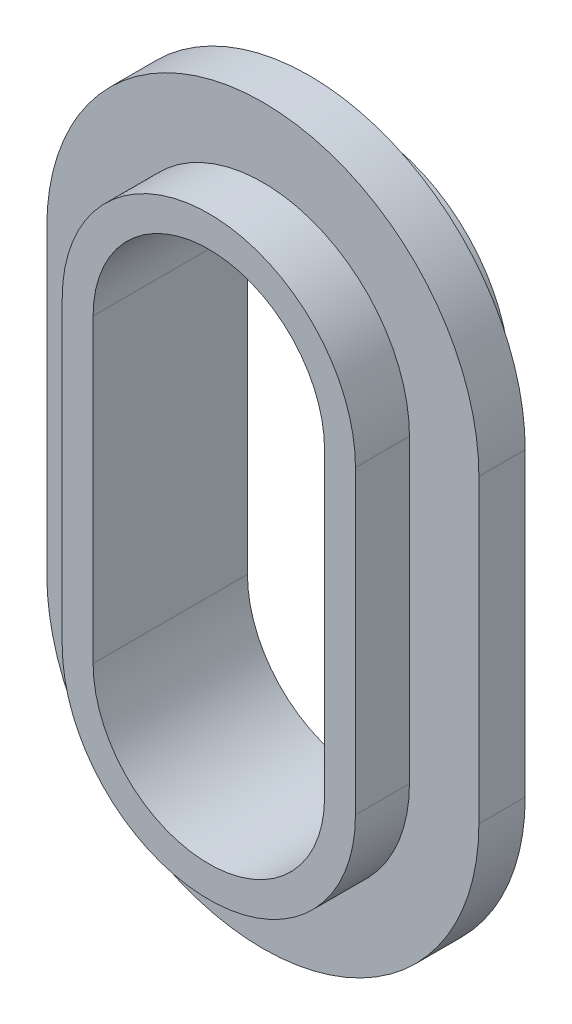
ISO-10303-21;
HEADER;
FILE_DESCRIPTION(('STEP AP214'),'2;1');
FILE_NAME('part.step','',(''),(''),'','','');
FILE_SCHEMA(('AUTOMOTIVE_DESIGN { 1 0 10303 214 1 1 1 1 }'));
ENDSEC;
DATA;
#1=APPLICATION_CONTEXT('core data for automotive mechanical design processes');
#2=APPLICATION_PROTOCOL_DEFINITION('international standard','automotive_design',2000,#1);
#3=PRODUCT_CONTEXT('',#1,'mechanical');
#4=PRODUCT('Part','Part','',(#3));
#5=PRODUCT_RELATED_PRODUCT_CATEGORY('part','',(#4));
#6=PRODUCT_DEFINITION_FORMATION('','',#4);
#7=PRODUCT_DEFINITION_CONTEXT('part definition',#1,'design');
#8=PRODUCT_DEFINITION('design','',#6,#7);
#9=PRODUCT_DEFINITION_SHAPE('','',#8);
#10=(LENGTH_UNIT() NAMED_UNIT(*) SI_UNIT(.MILLI.,.METRE.));
#11=(NAMED_UNIT(*) PLANE_ANGLE_UNIT() SI_UNIT($,.RADIAN.));
#12=(NAMED_UNIT(*) SI_UNIT($,.STERADIAN.) SOLID_ANGLE_UNIT());
#13=UNCERTAINTY_MEASURE_WITH_UNIT(LENGTH_MEASURE(1.E-05),#10,'distance_accuracy_value','');
#14=(GEOMETRIC_REPRESENTATION_CONTEXT(3) GLOBAL_UNCERTAINTY_ASSIGNED_CONTEXT((#13)) GLOBAL_UNIT_ASSIGNED_CONTEXT((#10,
#11,#12)) REPRESENTATION_CONTEXT('',''));
#15=CARTESIAN_POINT('',(0.,0.,0.));
#16=DIRECTION('',(0.,0.,1.));
#17=DIRECTION('',(1.,0.,0.));
#18=AXIS2_PLACEMENT_3D('',#15,#16,#17);
#19=CARTESIAN_POINT('',(0.,-7.8,2.));
#20=DIRECTION('',(0.,0.,1.));
#21=DIRECTION('',(1.,0.,0.));
#22=AXIS2_PLACEMENT_3D('',#19,#20,#21);
#23=PLANE('',#22);
#24=DIRECTION('',(0.,-1.,0.));
#25=VECTOR('',#24,1.);
#26=CARTESIAN_POINT('',(3.8,0.,2.));
#27=LINE('',#26,#25);
#28=CARTESIAN_POINT('',(3.8,0.,2.));
#29=VERTEX_POINT('',#28);
#30=CARTESIAN_POINT('',(3.8,-7.8,2.));
#31=VERTEX_POINT('',#30);
#32=EDGE_CURVE('E155',#29,#31,#27,.T.);
#33=ORIENTED_EDGE('',*,*,#32,.F.);
#34=CARTESIAN_POINT('',(0.,0.,2.));
#35=DIRECTION('',(0.,0.,1.));
#36=DIRECTION('',(1.,0.,0.));
#37=AXIS2_PLACEMENT_3D('',#34,#35,#36);
#38=CIRCLE('',#37,3.8);
#39=CARTESIAN_POINT('',(-3.8,0.,2.));
#40=VERTEX_POINT('',#39);
#41=EDGE_CURVE('E193',#29,#40,#38,.T.);
#42=ORIENTED_EDGE('',*,*,#41,.T.);
#43=DIRECTION('',(0.,-1.,0.));
#44=VECTOR('',#43,1.);
#45=CARTESIAN_POINT('',(-3.8,0.,2.));
#46=LINE('',#45,#44);
#47=CARTESIAN_POINT('',(-3.8,-7.8,2.));
#48=VERTEX_POINT('',#47);
#49=EDGE_CURVE('E190',#40,#48,#46,.T.);
#50=ORIENTED_EDGE('',*,*,#49,.T.);
#51=CARTESIAN_POINT('',(0.,-7.8,2.));
#52=DIRECTION('',(0.,0.,1.));
#53=DIRECTION('',(1.,0.,0.));
#54=AXIS2_PLACEMENT_3D('',#51,#52,#53);
#55=CIRCLE('',#54,3.8);
#56=EDGE_CURVE('E187',#48,#31,#55,.T.);
#57=ORIENTED_EDGE('',*,*,#56,.T.);
#58=EDGE_LOOP('',(#33,#42,#50,#57));
#59=FACE_BOUND('',#58,.T.);
#60=CARTESIAN_POINT('',(0.,0.,2.));
#61=DIRECTION('',(0.,0.,1.));
#62=DIRECTION('',(1.,0.,0.));
#63=AXIS2_PLACEMENT_3D('',#60,#61,#62);
#64=CIRCLE('',#63,3.);
#65=CARTESIAN_POINT('',(3.,0.,2.));
#66=VERTEX_POINT('',#65);
#67=CARTESIAN_POINT('',(-3.,0.,2.));
#68=VERTEX_POINT('',#67);
#69=EDGE_CURVE('E168',#66,#68,#64,.T.);
#70=ORIENTED_EDGE('',*,*,#69,.F.);
#71=DIRECTION('',(0.,-1.,0.));
#72=VECTOR('',#71,1.);
#73=CARTESIAN_POINT('',(3.,0.,2.));
#74=LINE('',#73,#72);
#75=CARTESIAN_POINT('',(3.,-7.8,2.));
#76=VERTEX_POINT('',#75);
#77=EDGE_CURVE('E52',#66,#76,#74,.T.);
#78=ORIENTED_EDGE('',*,*,#77,.T.);
#79=CARTESIAN_POINT('',(0.,-7.8,2.));
#80=DIRECTION('',(0.,0.,1.));
#81=DIRECTION('',(1.,0.,0.));
#82=AXIS2_PLACEMENT_3D('',#79,#80,#81);
#83=CIRCLE('',#82,3.);
#84=CARTESIAN_POINT('',(-3.,-7.8,2.));
#85=VERTEX_POINT('',#84);
#86=EDGE_CURVE('E159',#85,#76,#83,.T.);
#87=ORIENTED_EDGE('',*,*,#86,.F.);
#88=DIRECTION('',(0.,-1.,0.));
#89=VECTOR('',#88,1.);
#90=CARTESIAN_POINT('',(-3.,0.,2.));
#91=LINE('',#90,#89);
#92=EDGE_CURVE('E164',#68,#85,#91,.T.);
#93=ORIENTED_EDGE('',*,*,#92,.F.);
#94=EDGE_LOOP('',(#70,#78,#87,#93));
#95=FACE_BOUND('',#94,.T.);
#96=ADVANCED_FACE('F37',(#59,#95),#23,.T.);
#97=CARTESIAN_POINT('',(0.,-7.8,-2.));
#98=DIRECTION('',(0.,0.,1.));
#99=DIRECTION('',(1.,0.,0.));
#100=AXIS2_PLACEMENT_3D('',#97,#98,#99);
#101=PLANE('',#100);
#102=DIRECTION('',(0.,-1.,0.));
#103=VECTOR('',#102,1.);
#104=CARTESIAN_POINT('',(3.8,0.,-2.));
#105=LINE('',#104,#103);
#106=CARTESIAN_POINT('',(3.8,0.,-2.));
#107=VERTEX_POINT('',#106);
#108=CARTESIAN_POINT('',(3.8,-7.8,-2.));
#109=VERTEX_POINT('',#108);
#110=EDGE_CURVE('E196',#107,#109,#105,.T.);
#111=ORIENTED_EDGE('',*,*,#110,.T.);
#112=CARTESIAN_POINT('',(0.,-7.8,-2.));
#113=DIRECTION('',(0.,0.,1.));
#114=DIRECTION('',(1.,0.,0.));
#115=AXIS2_PLACEMENT_3D('',#112,#113,#114);
#116=CIRCLE('',#115,3.8);
#117=CARTESIAN_POINT('',(-3.8,-7.8,-2.));
#118=VERTEX_POINT('',#117);
#119=EDGE_CURVE('E198',#118,#109,#116,.T.);
#120=ORIENTED_EDGE('',*,*,#119,.F.);
#121=DIRECTION('',(0.,-1.,0.));
#122=VECTOR('',#121,1.);
#123=CARTESIAN_POINT('',(-3.8,0.,-2.));
#124=LINE('',#123,#122);
#125=CARTESIAN_POINT('',(-3.8,0.,-2.));
#126=VERTEX_POINT('',#125);
#127=EDGE_CURVE('E201',#126,#118,#124,.T.);
#128=ORIENTED_EDGE('',*,*,#127,.F.);
#129=CARTESIAN_POINT('',(0.,0.,-2.));
#130=DIRECTION('',(0.,0.,1.));
#131=DIRECTION('',(1.,0.,0.));
#132=AXIS2_PLACEMENT_3D('',#129,#130,#131);
#133=CIRCLE('',#132,3.8);
#134=EDGE_CURVE('E204',#107,#126,#133,.T.);
#135=ORIENTED_EDGE('',*,*,#134,.F.);
#136=EDGE_LOOP('',(#111,#120,#128,#135));
#137=FACE_BOUND('',#136,.T.);
#138=DIRECTION('',(0.,-1.,0.));
#139=VECTOR('',#138,1.);
#140=CARTESIAN_POINT('',(3.,0.,-2.));
#141=LINE('',#140,#139);
#142=CARTESIAN_POINT('',(3.,0.,-2.));
#143=VERTEX_POINT('',#142);
#144=CARTESIAN_POINT('',(3.,-7.8,-2.));
#145=VERTEX_POINT('',#144);
#146=EDGE_CURVE('E151',#143,#145,#141,.T.);
#147=ORIENTED_EDGE('',*,*,#146,.F.);
#148=CARTESIAN_POINT('',(0.,0.,-2.));
#149=DIRECTION('',(0.,0.,1.));
#150=DIRECTION('',(1.,0.,0.));
#151=AXIS2_PLACEMENT_3D('',#148,#149,#150);
#152=CIRCLE('',#151,3.);
#153=CARTESIAN_POINT('',(-3.,0.,-2.));
#154=VERTEX_POINT('',#153);
#155=EDGE_CURVE('E177',#143,#154,#152,.T.);
#156=ORIENTED_EDGE('',*,*,#155,.T.);
#157=DIRECTION('',(0.,-1.,0.));
#158=VECTOR('',#157,1.);
#159=CARTESIAN_POINT('',(-3.,0.,-2.));
#160=LINE('',#159,#158);
#161=CARTESIAN_POINT('',(-3.,-7.8,-2.));
#162=VERTEX_POINT('',#161);
#163=EDGE_CURVE('E60',#154,#162,#160,.T.);
#164=ORIENTED_EDGE('',*,*,#163,.T.);
#165=CARTESIAN_POINT('',(0.,-7.8,-2.));
#166=DIRECTION('',(0.,0.,1.));
#167=DIRECTION('',(1.,0.,0.));
#168=AXIS2_PLACEMENT_3D('',#165,#166,#167);
#169=CIRCLE('',#168,3.);
#170=EDGE_CURVE('E174',#162,#145,#169,.T.);
#171=ORIENTED_EDGE('',*,*,#170,.T.);
#172=EDGE_LOOP('',(#147,#156,#164,#171));
#173=FACE_BOUND('',#172,.T.);
#174=ADVANCED_FACE('F306',(#137,#173),#101,.F.);
#175=CARTESIAN_POINT('',(0.,0.,-0.6));
#176=DIRECTION('',(0.,0.,1.));
#177=DIRECTION('',(1.,0.,0.));
#178=AXIS2_PLACEMENT_3D('',#175,#176,#177);
#179=PLANE('',#178);
#180=DIRECTION('',(0.,-1.,0.));
#181=VECTOR('',#180,1.);
#182=CARTESIAN_POINT('',(-5.6,0.,-0.6));
#183=LINE('',#182,#181);
#184=CARTESIAN_POINT('',(-5.6,0.,-0.6));
#185=VERTEX_POINT('',#184);
#186=CARTESIAN_POINT('',(-5.6,-7.8,-0.6));
#187=VERTEX_POINT('',#186);
#188=EDGE_CURVE('E245',#185,#187,#183,.T.);
#189=ORIENTED_EDGE('',*,*,#188,.F.);
#190=CARTESIAN_POINT('',(0.,0.,-0.6));
#191=DIRECTION('',(0.,0.,1.));
#192=DIRECTION('',(1.,0.,0.));
#193=AXIS2_PLACEMENT_3D('',#190,#191,#192);
#194=CIRCLE('',#193,5.6);
#195=CARTESIAN_POINT('',(5.6,0.,-0.6));
#196=VERTEX_POINT('',#195);
#197=EDGE_CURVE('E253',#196,#185,#194,.T.);
#198=ORIENTED_EDGE('',*,*,#197,.F.);
#199=DIRECTION('',(0.,-1.,0.));
#200=VECTOR('',#199,1.);
#201=CARTESIAN_POINT('',(5.6,0.,-0.6));
#202=LINE('',#201,#200);
#203=CARTESIAN_POINT('',(5.6,-7.8,-0.6));
#204=VERTEX_POINT('',#203);
#205=EDGE_CURVE('E251',#196,#204,#202,.T.);
#206=ORIENTED_EDGE('',*,*,#205,.T.);
#207=CARTESIAN_POINT('',(0.,-7.8,-0.6));
#208=DIRECTION('',(0.,0.,1.));
#209=DIRECTION('',(1.,0.,0.));
#210=AXIS2_PLACEMENT_3D('',#207,#208,#209);
#211=CIRCLE('',#210,5.6);
#212=EDGE_CURVE('E248',#187,#204,#211,.T.);
#213=ORIENTED_EDGE('',*,*,#212,.F.);
#214=EDGE_LOOP('',(#189,#198,#206,#213));
#215=FACE_BOUND('',#214,.T.);
#216=DIRECTION('',(0.,-1.,0.));
#217=VECTOR('',#216,1.);
#218=CARTESIAN_POINT('',(3.8,0.,-0.6));
#219=LINE('',#218,#217);
#220=CARTESIAN_POINT('',(3.8,0.,-0.6));
#221=VERTEX_POINT('',#220);
#222=CARTESIAN_POINT('',(3.8,-7.8,-0.6));
#223=VERTEX_POINT('',#222);
#224=EDGE_CURVE('E231',#221,#223,#219,.T.);
#225=ORIENTED_EDGE('',*,*,#224,.F.);
#226=CARTESIAN_POINT('',(0.,0.,-0.6));
#227=DIRECTION('',(0.,0.,1.));
#228=DIRECTION('',(1.,0.,0.));
#229=AXIS2_PLACEMENT_3D('',#226,#227,#228);
#230=CIRCLE('',#229,3.8);
#231=CARTESIAN_POINT('',(-3.8,0.,-0.6));
#232=VERTEX_POINT('',#231);
#233=EDGE_CURVE('E222',#221,#232,#230,.T.);
#234=ORIENTED_EDGE('',*,*,#233,.T.);
#235=DIRECTION('',(0.,-1.,0.));
#236=VECTOR('',#235,1.);
#237=CARTESIAN_POINT('',(-3.8,0.,-0.6));
#238=LINE('',#237,#236);
#239=CARTESIAN_POINT('',(-3.8,-7.8,-0.6));
#240=VERTEX_POINT('',#239);
#241=EDGE_CURVE('E225',#232,#240,#238,.T.);
#242=ORIENTED_EDGE('',*,*,#241,.T.);
#243=CARTESIAN_POINT('',(0.,-7.8,-0.6));
#244=DIRECTION('',(0.,0.,1.));
#245=DIRECTION('',(1.,0.,0.));
#246=AXIS2_PLACEMENT_3D('',#243,#244,#245);
#247=CIRCLE('',#246,3.8);
#248=EDGE_CURVE('E228',#240,#223,#247,.T.);
#249=ORIENTED_EDGE('',*,*,#248,.T.);
#250=EDGE_LOOP('',(#225,#234,#242,#249));
#251=FACE_BOUND('',#250,.T.);
#252=ADVANCED_FACE('F311',(#215,#251),#179,.F.);
#253=CARTESIAN_POINT('',(0.,0.,0.6));
#254=DIRECTION('',(0.,0.,1.));
#255=DIRECTION('',(1.,0.,0.));
#256=AXIS2_PLACEMENT_3D('',#253,#254,#255);
#257=PLANE('',#256);
#258=DIRECTION('',(0.,-1.,0.));
#259=VECTOR('',#258,1.);
#260=CARTESIAN_POINT('',(-5.6,0.,0.6));
#261=LINE('',#260,#259);
#262=CARTESIAN_POINT('',(-5.6,0.,0.6));
#263=VERTEX_POINT('',#262);
#264=CARTESIAN_POINT('',(-5.6,-7.8,0.6));
#265=VERTEX_POINT('',#264);
#266=EDGE_CURVE('E233',#263,#265,#261,.T.);
#267=ORIENTED_EDGE('',*,*,#266,.T.);
#268=CARTESIAN_POINT('',(0.,-7.8,0.6));
#269=DIRECTION('',(0.,0.,1.));
#270=DIRECTION('',(1.,0.,0.));
#271=AXIS2_PLACEMENT_3D('',#268,#269,#270);
#272=CIRCLE('',#271,5.6);
#273=CARTESIAN_POINT('',(5.6,-7.8,0.6));
#274=VERTEX_POINT('',#273);
#275=EDGE_CURVE('E236',#265,#274,#272,.T.);
#276=ORIENTED_EDGE('',*,*,#275,.T.);
#277=DIRECTION('',(0.,-1.,0.));
#278=VECTOR('',#277,1.);
#279=CARTESIAN_POINT('',(5.6,0.,0.6));
#280=LINE('',#279,#278);
#281=CARTESIAN_POINT('',(5.6,0.,0.6));
#282=VERTEX_POINT('',#281);
#283=EDGE_CURVE('E239',#282,#274,#280,.T.);
#284=ORIENTED_EDGE('',*,*,#283,.F.);
#285=CARTESIAN_POINT('',(0.,0.,0.6));
#286=DIRECTION('',(0.,0.,1.));
#287=DIRECTION('',(1.,0.,0.));
#288=AXIS2_PLACEMENT_3D('',#285,#286,#287);
#289=CIRCLE('',#288,5.6);
#290=EDGE_CURVE('E242',#282,#263,#289,.T.);
#291=ORIENTED_EDGE('',*,*,#290,.T.);
#292=EDGE_LOOP('',(#267,#276,#284,#291));
#293=FACE_BOUND('',#292,.T.);
#294=CARTESIAN_POINT('',(0.,0.,0.6));
#295=DIRECTION('',(0.,0.,1.));
#296=DIRECTION('',(1.,0.,0.));
#297=AXIS2_PLACEMENT_3D('',#294,#295,#296);
#298=CIRCLE('',#297,3.8);
#299=CARTESIAN_POINT('',(3.8,0.,0.6));
#300=VERTEX_POINT('',#299);
#301=CARTESIAN_POINT('',(-3.8,0.,0.6));
#302=VERTEX_POINT('',#301);
#303=EDGE_CURVE('E259',#300,#302,#298,.T.);
#304=ORIENTED_EDGE('',*,*,#303,.F.);
#305=DIRECTION('',(0.,-1.,0.));
#306=VECTOR('',#305,1.);
#307=CARTESIAN_POINT('',(3.8,0.,0.6));
#308=LINE('',#307,#306);
#309=CARTESIAN_POINT('',(3.8,-7.8,0.6));
#310=VERTEX_POINT('',#309);
#311=EDGE_CURVE('E11',#300,#310,#308,.T.);
#312=ORIENTED_EDGE('',*,*,#311,.T.);
#313=CARTESIAN_POINT('',(0.,-7.8,0.6));
#314=DIRECTION('',(0.,0.,1.));
#315=DIRECTION('',(1.,0.,0.));
#316=AXIS2_PLACEMENT_3D('',#313,#314,#315);
#317=CIRCLE('',#316,3.8);
#318=CARTESIAN_POINT('',(-3.8,-7.8,0.6));
#319=VERTEX_POINT('',#318);
#320=EDGE_CURVE('E45',#319,#310,#317,.T.);
#321=ORIENTED_EDGE('',*,*,#320,.F.);
#322=DIRECTION('',(0.,-1.,0.));
#323=VECTOR('',#322,1.);
#324=CARTESIAN_POINT('',(-3.8,0.,0.6));
#325=LINE('',#324,#323);
#326=EDGE_CURVE('E267',#302,#319,#325,.T.);
#327=ORIENTED_EDGE('',*,*,#326,.F.);
#328=EDGE_LOOP('',(#304,#312,#321,#327));
#329=FACE_BOUND('',#328,.T.);
#330=ADVANCED_FACE('F287',(#293,#329),#257,.T.);
#331=CARTESIAN_POINT('',(-5.6,0.,-0.6));
#332=DIRECTION('',(-1.,0.,0.));
#333=DIRECTION('',(0.,-1.,0.));
#334=AXIS2_PLACEMENT_3D('',#331,#332,#333);
#335=PLANE('',#334);
#336=DIRECTION('',(0.,0.,1.));
#337=VECTOR('',#336,1.);
#338=CARTESIAN_POINT('',(-5.6,-7.8,-0.6));
#339=LINE('',#338,#337);
#340=EDGE_CURVE('E256',#187,#265,#339,.T.);
#341=ORIENTED_EDGE('',*,*,#340,.T.);
#342=ORIENTED_EDGE('',*,*,#266,.F.);
#343=DIRECTION('',(0.,0.,1.));
#344=VECTOR('',#343,1.);
#345=CARTESIAN_POINT('',(-5.6,0.,-0.6));
#346=LINE('',#345,#344);
#347=EDGE_CURVE('E257',#185,#263,#346,.T.);
#348=ORIENTED_EDGE('',*,*,#347,.F.);
#349=ORIENTED_EDGE('',*,*,#188,.T.);
#350=EDGE_LOOP('',(#341,#342,#348,#349));
#351=FACE_BOUND('',#350,.T.);
#352=ADVANCED_FACE('F39',(#351),#335,.T.);
#353=CARTESIAN_POINT('',(0.,0.,-0.6));
#354=DIRECTION('',(0.,0.,1.));
#355=DIRECTION('',(1.,0.,0.));
#356=AXIS2_PLACEMENT_3D('',#353,#354,#355);
#357=CYLINDRICAL_SURFACE('',#356,5.6);
#358=ORIENTED_EDGE('',*,*,#347,.T.);
#359=ORIENTED_EDGE('',*,*,#290,.F.);
#360=DIRECTION('',(0.,0.,1.));
#361=VECTOR('',#360,1.);
#362=CARTESIAN_POINT('',(5.6,0.,-0.6));
#363=LINE('',#362,#361);
#364=EDGE_CURVE('E260',#196,#282,#363,.T.);
#365=ORIENTED_EDGE('',*,*,#364,.F.);
#366=ORIENTED_EDGE('',*,*,#197,.T.);
#367=EDGE_LOOP('',(#358,#359,#365,#366));
#368=FACE_BOUND('',#367,.T.);
#369=ADVANCED_FACE('F421',(#368),#357,.T.);
#370=CARTESIAN_POINT('',(5.6,0.,-0.6));
#371=DIRECTION('',(-1.,0.,0.));
#372=DIRECTION('',(0.,-1.,0.));
#373=AXIS2_PLACEMENT_3D('',#370,#371,#372);
#374=PLANE('',#373);
#375=ORIENTED_EDGE('',*,*,#364,.T.);
#376=ORIENTED_EDGE('',*,*,#283,.T.);
#377=DIRECTION('',(0.,0.,1.));
#378=VECTOR('',#377,1.);
#379=CARTESIAN_POINT('',(5.6,-7.8,-0.6));
#380=LINE('',#379,#378);
#381=EDGE_CURVE('E262',#204,#274,#380,.T.);
#382=ORIENTED_EDGE('',*,*,#381,.F.);
#383=ORIENTED_EDGE('',*,*,#205,.F.);
#384=EDGE_LOOP('',(#375,#376,#382,#383));
#385=FACE_BOUND('',#384,.T.);
#386=ADVANCED_FACE('F300',(#385),#374,.F.);
#387=CARTESIAN_POINT('',(0.,-7.8,-0.6));
#388=DIRECTION('',(0.,0.,1.));
#389=DIRECTION('',(1.,0.,0.));
#390=AXIS2_PLACEMENT_3D('',#387,#388,#389);
#391=CYLINDRICAL_SURFACE('',#390,5.6);
#392=ORIENTED_EDGE('',*,*,#381,.T.);
#393=ORIENTED_EDGE('',*,*,#275,.F.);
#394=ORIENTED_EDGE('',*,*,#340,.F.);
#395=ORIENTED_EDGE('',*,*,#212,.T.);
#396=EDGE_LOOP('',(#392,#393,#394,#395));
#397=FACE_BOUND('',#396,.T.);
#398=ADVANCED_FACE('F291',(#397),#391,.T.);
#399=CARTESIAN_POINT('',(0.,0.,-2.));
#400=DIRECTION('',(0.,0.,1.));
#401=DIRECTION('',(1.,0.,0.));
#402=AXIS2_PLACEMENT_3D('',#399,#400,#401);
#403=CYLINDRICAL_SURFACE('',#402,3.8);
#404=DIRECTION('',(0.,0.,1.));
#405=VECTOR('',#404,1.);
#406=CARTESIAN_POINT('',(3.8,0.,-2.));
#407=LINE('',#406,#405);
#408=EDGE_CURVE('E207',#300,#29,#407,.T.);
#409=ORIENTED_EDGE('',*,*,#408,.F.);
#410=ORIENTED_EDGE('',*,*,#303,.T.);
#411=DIRECTION('',(0.,0.,1.));
#412=VECTOR('',#411,1.);
#413=CARTESIAN_POINT('',(-3.8,0.,-2.));
#414=LINE('',#413,#412);
#415=EDGE_CURVE('E211',#302,#40,#414,.T.);
#416=ORIENTED_EDGE('',*,*,#415,.T.);
#417=ORIENTED_EDGE('',*,*,#41,.F.);
#418=EDGE_LOOP('',(#409,#410,#416,#417));
#419=FACE_BOUND('',#418,.T.);
#420=ADVANCED_FACE('F289',(#419),#403,.T.);
#421=CARTESIAN_POINT('',(-3.8,0.,-2.));
#422=DIRECTION('',(-1.,0.,0.));
#423=DIRECTION('',(0.,-1.,0.));
#424=AXIS2_PLACEMENT_3D('',#421,#422,#423);
#425=PLANE('',#424);
#426=ORIENTED_EDGE('',*,*,#415,.F.);
#427=ORIENTED_EDGE('',*,*,#326,.T.);
#428=DIRECTION('',(0.,0.,1.));
#429=VECTOR('',#428,1.);
#430=CARTESIAN_POINT('',(-3.8,-7.8,-2.));
#431=LINE('',#430,#429);
#432=EDGE_CURVE('E214',#319,#48,#431,.T.);
#433=ORIENTED_EDGE('',*,*,#432,.T.);
#434=ORIENTED_EDGE('',*,*,#49,.F.);
#435=EDGE_LOOP('',(#426,#427,#433,#434));
#436=FACE_BOUND('',#435,.T.);
#437=ADVANCED_FACE('F286',(#436),#425,.T.);
#438=CARTESIAN_POINT('',(0.,-7.8,-2.));
#439=DIRECTION('',(0.,0.,1.));
#440=DIRECTION('',(1.,0.,0.));
#441=AXIS2_PLACEMENT_3D('',#438,#439,#440);
#442=CYLINDRICAL_SURFACE('',#441,3.8);
#443=ORIENTED_EDGE('',*,*,#432,.F.);
#444=ORIENTED_EDGE('',*,*,#320,.T.);
#445=DIRECTION('',(0.,0.,1.));
#446=VECTOR('',#445,1.);
#447=CARTESIAN_POINT('',(3.8,-7.8,-2.));
#448=LINE('',#447,#446);
#449=EDGE_CURVE('E218',#310,#31,#448,.T.);
#450=ORIENTED_EDGE('',*,*,#449,.T.);
#451=ORIENTED_EDGE('',*,*,#56,.F.);
#452=EDGE_LOOP('',(#443,#444,#450,#451));
#453=FACE_BOUND('',#452,.T.);
#454=ADVANCED_FACE('F273',(#453),#442,.T.);
#455=CARTESIAN_POINT('',(3.8,0.,-2.));
#456=DIRECTION('',(-1.,0.,0.));
#457=DIRECTION('',(0.,-1.,0.));
#458=AXIS2_PLACEMENT_3D('',#455,#456,#457);
#459=PLANE('',#458);
#460=ORIENTED_EDGE('',*,*,#311,.F.);
#461=ORIENTED_EDGE('',*,*,#408,.T.);
#462=ORIENTED_EDGE('',*,*,#32,.T.);
#463=ORIENTED_EDGE('',*,*,#449,.F.);
#464=EDGE_LOOP('',(#460,#461,#462,#463));
#465=FACE_BOUND('',#464,.T.);
#466=ADVANCED_FACE('F278',(#465),#459,.F.);
#467=EDGE_CURVE('E208',#107,#221,#407,.T.);
#468=ORIENTED_EDGE('',*,*,#467,.T.);
#469=ORIENTED_EDGE('',*,*,#224,.T.);
#470=EDGE_CURVE('E219',#109,#223,#448,.T.);
#471=ORIENTED_EDGE('',*,*,#470,.F.);
#472=ORIENTED_EDGE('',*,*,#110,.F.);
#473=EDGE_LOOP('',(#468,#469,#471,#472));
#474=FACE_BOUND('',#473,.T.);
#475=ADVANCED_FACE('F358',(#474),#459,.F.);
#476=ORIENTED_EDGE('',*,*,#248,.F.);
#477=EDGE_CURVE('E215',#118,#240,#431,.T.);
#478=ORIENTED_EDGE('',*,*,#477,.F.);
#479=ORIENTED_EDGE('',*,*,#119,.T.);
#480=ORIENTED_EDGE('',*,*,#470,.T.);
#481=EDGE_LOOP('',(#476,#478,#479,#480));
#482=FACE_BOUND('',#481,.T.);
#483=ADVANCED_FACE('F351',(#482),#442,.T.);
#484=ORIENTED_EDGE('',*,*,#241,.F.);
#485=EDGE_CURVE('E212',#126,#232,#414,.T.);
#486=ORIENTED_EDGE('',*,*,#485,.F.);
#487=ORIENTED_EDGE('',*,*,#127,.T.);
#488=ORIENTED_EDGE('',*,*,#477,.T.);
#489=EDGE_LOOP('',(#484,#486,#487,#488));
#490=FACE_BOUND('',#489,.T.);
#491=ADVANCED_FACE('F299',(#490),#425,.T.);
#492=ORIENTED_EDGE('',*,*,#233,.F.);
#493=ORIENTED_EDGE('',*,*,#467,.F.);
#494=ORIENTED_EDGE('',*,*,#134,.T.);
#495=ORIENTED_EDGE('',*,*,#485,.T.);
#496=EDGE_LOOP('',(#492,#493,#494,#495));
#497=FACE_BOUND('',#496,.T.);
#498=ADVANCED_FACE('F293',(#497),#403,.T.);
#499=CARTESIAN_POINT('',(3.,0.,-2.));
#500=DIRECTION('',(-1.,0.,0.));
#501=DIRECTION('',(0.,-1.,0.));
#502=AXIS2_PLACEMENT_3D('',#499,#500,#501);
#503=PLANE('',#502);
#504=DIRECTION('',(0.,0.,1.));
#505=VECTOR('',#504,1.);
#506=CARTESIAN_POINT('',(3.,0.,-2.));
#507=LINE('',#506,#505);
#508=EDGE_CURVE('E180',#143,#66,#507,.T.);
#509=ORIENTED_EDGE('',*,*,#508,.F.);
#510=ORIENTED_EDGE('',*,*,#146,.T.);
#511=DIRECTION('',(0.,0.,1.));
#512=VECTOR('',#511,1.);
#513=CARTESIAN_POINT('',(3.,-7.8,-2.));
#514=LINE('',#513,#512);
#515=EDGE_CURVE('E147',#145,#76,#514,.T.);
#516=ORIENTED_EDGE('',*,*,#515,.T.);
#517=ORIENTED_EDGE('',*,*,#77,.F.);
#518=EDGE_LOOP('',(#509,#510,#516,#517));
#519=FACE_BOUND('',#518,.T.);
#520=ADVANCED_FACE('F149',(#519),#503,.T.);
#521=CARTESIAN_POINT('',(0.,-7.8,-2.));
#522=DIRECTION('',(0.,0.,1.));
#523=DIRECTION('',(1.,0.,0.));
#524=AXIS2_PLACEMENT_3D('',#521,#522,#523);
#525=CYLINDRICAL_SURFACE('',#524,3.);
#526=ORIENTED_EDGE('',*,*,#515,.F.);
#527=ORIENTED_EDGE('',*,*,#170,.F.);
#528=DIRECTION('',(0.,0.,1.));
#529=VECTOR('',#528,1.);
#530=CARTESIAN_POINT('',(-3.,-7.8,-2.));
#531=LINE('',#530,#529);
#532=EDGE_CURVE('E156',#162,#85,#531,.T.);
#533=ORIENTED_EDGE('',*,*,#532,.T.);
#534=ORIENTED_EDGE('',*,*,#86,.T.);
#535=EDGE_LOOP('',(#526,#527,#533,#534));
#536=FACE_BOUND('',#535,.T.);
#537=ADVANCED_FACE('F160',(#536),#525,.F.);
#538=CARTESIAN_POINT('',(-3.,0.,-2.));
#539=DIRECTION('',(-1.,0.,0.));
#540=DIRECTION('',(0.,-1.,0.));
#541=AXIS2_PLACEMENT_3D('',#538,#539,#540);
#542=PLANE('',#541);
#543=ORIENTED_EDGE('',*,*,#532,.F.);
#544=ORIENTED_EDGE('',*,*,#163,.F.);
#545=DIRECTION('',(0.,0.,1.));
#546=VECTOR('',#545,1.);
#547=CARTESIAN_POINT('',(-3.,0.,-2.));
#548=LINE('',#547,#546);
#549=EDGE_CURVE('E182',#154,#68,#548,.T.);
#550=ORIENTED_EDGE('',*,*,#549,.T.);
#551=ORIENTED_EDGE('',*,*,#92,.T.);
#552=EDGE_LOOP('',(#543,#544,#550,#551));
#553=FACE_BOUND('',#552,.T.);
#554=ADVANCED_FACE('F318',(#553),#542,.F.);
#555=CARTESIAN_POINT('',(0.,0.,-2.));
#556=DIRECTION('',(0.,0.,1.));
#557=DIRECTION('',(1.,0.,0.));
#558=AXIS2_PLACEMENT_3D('',#555,#556,#557);
#559=CYLINDRICAL_SURFACE('',#558,3.);
#560=ORIENTED_EDGE('',*,*,#549,.F.);
#561=ORIENTED_EDGE('',*,*,#155,.F.);
#562=ORIENTED_EDGE('',*,*,#508,.T.);
#563=ORIENTED_EDGE('',*,*,#69,.T.);
#564=EDGE_LOOP('',(#560,#561,#562,#563));
#565=FACE_BOUND('',#564,.T.);
#566=ADVANCED_FACE('F321',(#565),#559,.F.);
#567=CLOSED_SHELL('',(#96,#174,#252,#330,#352,#369,#386,#398,#420,#437,#454,#466,#475,#483,#491,
#498,#520,#537,#554,#566));
#568=MANIFOLD_SOLID_BREP('B2',#567);
#569=ADVANCED_BREP_SHAPE_REPRESENTATION('',(#18,#568),#14);
#570=SHAPE_DEFINITION_REPRESENTATION(#9,#569);
ENDSEC;
END-ISO-10303-21;
